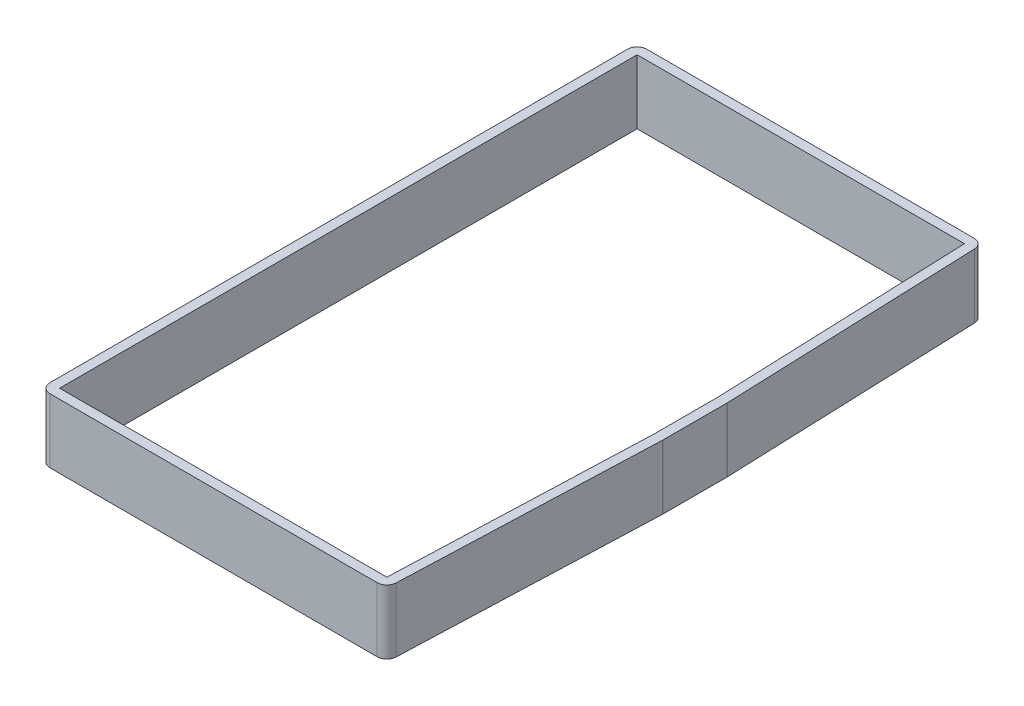
ISO-10303-21;
HEADER;
FILE_DESCRIPTION(('STEP AP214'),'2;1');
FILE_NAME('part.step','',(''),(''),'','','');
FILE_SCHEMA(('AUTOMOTIVE_DESIGN { 1 0 10303 214 1 1 1 1 }'));
ENDSEC;
DATA;
#1=APPLICATION_CONTEXT('core data for automotive mechanical design processes');
#2=APPLICATION_PROTOCOL_DEFINITION('international standard','automotive_design',2000,#1);
#3=PRODUCT_CONTEXT('',#1,'mechanical');
#4=PRODUCT('Part','Part','',(#3));
#5=PRODUCT_RELATED_PRODUCT_CATEGORY('part','',(#4));
#6=PRODUCT_DEFINITION_FORMATION('','',#4);
#7=PRODUCT_DEFINITION_CONTEXT('part definition',#1,'design');
#8=PRODUCT_DEFINITION('design','',#6,#7);
#9=PRODUCT_DEFINITION_SHAPE('','',#8);
#10=(LENGTH_UNIT() NAMED_UNIT(*) SI_UNIT(.MILLI.,.METRE.));
#11=(NAMED_UNIT(*) PLANE_ANGLE_UNIT() SI_UNIT($,.RADIAN.));
#12=(NAMED_UNIT(*) SI_UNIT($,.STERADIAN.) SOLID_ANGLE_UNIT());
#13=UNCERTAINTY_MEASURE_WITH_UNIT(LENGTH_MEASURE(1.E-05),#10,'distance_accuracy_value','');
#14=(GEOMETRIC_REPRESENTATION_CONTEXT(3) GLOBAL_UNCERTAINTY_ASSIGNED_CONTEXT((#13)) GLOBAL_UNIT_ASSIGNED_CONTEXT((#10,
#11,#12)) REPRESENTATION_CONTEXT('',''));
#15=CARTESIAN_POINT('',(0.,0.,0.));
#16=DIRECTION('',(0.,0.,1.));
#17=DIRECTION('',(1.,0.,0.));
#18=AXIS2_PLACEMENT_3D('',#15,#16,#17);
#19=CARTESIAN_POINT('',(0.,10.,0.));
#20=DIRECTION('',(0.,1.,0.));
#21=DIRECTION('',(0.,0.,1.));
#22=AXIS2_PLACEMENT_3D('',#19,#20,#21);
#23=PLANE('',#22);
#24=DIRECTION('',(-1.,0.,0.));
#25=VECTOR('',#24,1.);
#26=CARTESIAN_POINT('',(0.,10.,-92.9999999999999));
#27=LINE('',#26,#25);
#28=CARTESIAN_POINT('',(51.,10.,-92.9999999999999));
#29=VERTEX_POINT('',#28);
#30=CARTESIAN_POINT('',(-51.,10.,-92.9999999999999));
#31=VERTEX_POINT('',#30);
#32=EDGE_CURVE('E266',#29,#31,#27,.T.);
#33=ORIENTED_EDGE('',*,*,#32,.T.);
#34=CARTESIAN_POINT('',(-51.,10.,-89.9999999999999));
#35=DIRECTION('',(0.,1.,0.));
#36=DIRECTION('',(0.,0.,1.));
#37=AXIS2_PLACEMENT_3D('',#34,#35,#36);
#38=CIRCLE('',#37,3.);
#39=CARTESIAN_POINT('',(-54.,10.,-89.9999999999999));
#40=VERTEX_POINT('',#39);
#41=EDGE_CURVE('E323',#31,#40,#38,.T.);
#42=ORIENTED_EDGE('',*,*,#41,.T.);
#43=DIRECTION('',(0.,0.,1.));
#44=VECTOR('',#43,1.);
#45=CARTESIAN_POINT('',(-54.,10.,0.));
#46=LINE('',#45,#44);
#47=CARTESIAN_POINT('',(-54.,10.,90.0000000000001));
#48=VERTEX_POINT('',#47);
#49=EDGE_CURVE('E270',#40,#48,#46,.T.);
#50=ORIENTED_EDGE('',*,*,#49,.T.);
#51=CARTESIAN_POINT('',(-51.,10.,90.0000000000001));
#52=DIRECTION('',(0.,1.,0.));
#53=DIRECTION('',(0.,0.,1.));
#54=AXIS2_PLACEMENT_3D('',#51,#52,#53);
#55=CIRCLE('',#54,3.);
#56=CARTESIAN_POINT('',(-51.,10.,93.0000000000001));
#57=VERTEX_POINT('',#56);
#58=EDGE_CURVE('E314',#48,#57,#55,.T.);
#59=ORIENTED_EDGE('',*,*,#58,.T.);
#60=DIRECTION('',(1.,0.,0.));
#61=VECTOR('',#60,1.);
#62=CARTESIAN_POINT('',(0.,10.,93.0000000000001));
#63=LINE('',#62,#61);
#64=CARTESIAN_POINT('',(51.,10.,93.0000000000001));
#65=VERTEX_POINT('',#64);
#66=EDGE_CURVE('E273',#57,#65,#63,.T.);
#67=ORIENTED_EDGE('',*,*,#66,.T.);
#68=CARTESIAN_POINT('',(51.,10.,90.0000000000001));
#69=DIRECTION('',(0.,1.,0.));
#70=DIRECTION('',(0.,0.,1.));
#71=AXIS2_PLACEMENT_3D('',#68,#69,#70);
#72=CIRCLE('',#71,3.);
#73=CARTESIAN_POINT('',(53.9978928471276,10.,90.1124209817674));
#74=VERTEX_POINT('',#73);
#75=EDGE_CURVE('E97',#65,#74,#72,.T.);
#76=ORIENTED_EDGE('',*,*,#75,.T.);
#77=DIRECTION('',(0.0374736605890939,0.,-0.999297615709181));
#78=VECTOR('',#77,1.);
#79=CARTESIAN_POINT('',(57.2965353810642,10.,2.14862007678989));
#80=LINE('',#79,#78);
#81=CARTESIAN_POINT('',(56.9978928471275,10.,10.1124209817675));
#82=VERTEX_POINT('',#81);
#83=EDGE_CURVE('E275',#74,#82,#80,.T.);
#84=ORIENTED_EDGE('',*,*,#83,.T.);
#85=CARTESIAN_POINT('',(54.,10.,10.0000000000002));
#86=DIRECTION('',(0.,1.,0.));
#87=DIRECTION('',(0.,0.,1.));
#88=AXIS2_PLACEMENT_3D('',#85,#86,#87);
#89=CIRCLE('',#88,3.);
#90=CARTESIAN_POINT('',(57.,10.,10.0000000000002));
#91=VERTEX_POINT('',#90);
#92=EDGE_CURVE('E317',#82,#91,#89,.T.);
#93=ORIENTED_EDGE('',*,*,#92,.T.);
#94=DIRECTION('',(0.,0.,-1.));
#95=VECTOR('',#94,1.);
#96=CARTESIAN_POINT('',(57.,10.,0.));
#97=LINE('',#96,#95);
#98=CARTESIAN_POINT('',(57.,10.,-9.99999999999981));
#99=VERTEX_POINT('',#98);
#100=EDGE_CURVE('E259',#91,#99,#97,.T.);
#101=ORIENTED_EDGE('',*,*,#100,.T.);
#102=CARTESIAN_POINT('',(54.,10.,-9.99999999999981));
#103=DIRECTION('',(0.,1.,0.));
#104=DIRECTION('',(0.,0.,1.));
#105=AXIS2_PLACEMENT_3D('',#102,#103,#104);
#106=CIRCLE('',#105,3.);
#107=CARTESIAN_POINT('',(56.9978928471275,10.,-10.1124209817671));
#108=VERTEX_POINT('',#107);
#109=EDGE_CURVE('E319',#99,#108,#106,.T.);
#110=ORIENTED_EDGE('',*,*,#109,.T.);
#111=DIRECTION('',(-0.0374736605890941,0.,-0.999297615709181));
#112=VECTOR('',#111,1.);
#113=CARTESIAN_POINT('',(57.2965353810642,10.,-2.14862007678989));
#114=LINE('',#113,#112);
#115=CARTESIAN_POINT('',(53.9978928471275,10.,-90.1124209817672));
#116=VERTEX_POINT('',#115);
#117=EDGE_CURVE('E262',#108,#116,#114,.T.);
#118=ORIENTED_EDGE('',*,*,#117,.T.);
#119=CARTESIAN_POINT('',(51.,10.,-89.9999999999999));
#120=DIRECTION('',(0.,1.,0.));
#121=DIRECTION('',(0.,0.,1.));
#122=AXIS2_PLACEMENT_3D('',#119,#120,#121);
#123=CIRCLE('',#122,3.);
#124=EDGE_CURVE('E321',#116,#29,#123,.T.);
#125=ORIENTED_EDGE('',*,*,#124,.T.);
#126=EDGE_LOOP('',(#33,#42,#50,#59,#67,#76,#84,#93,#101,#110,#118,#125));
#127=FACE_BOUND('',#126,.T.);
#128=DIRECTION('',(-0.0374736605890941,0.,-0.999297615709181));
#129=VECTOR('',#128,1.);
#130=CARTESIAN_POINT('',(54.,10.,-10.));
#131=LINE('',#130,#129);
#132=CARTESIAN_POINT('',(54.,10.,-10.));
#133=VERTEX_POINT('',#132);
#134=CARTESIAN_POINT('',(51.,10.,-89.9999999999999));
#135=VERTEX_POINT('',#134);
#136=EDGE_CURVE('E212',#133,#135,#131,.T.);
#137=ORIENTED_EDGE('',*,*,#136,.F.);
#138=DIRECTION('',(0.,0.,-1.));
#139=VECTOR('',#138,1.);
#140=CARTESIAN_POINT('',(54.,10.,9.99999999999999));
#141=LINE('',#140,#139);
#142=CARTESIAN_POINT('',(54.,10.,9.99999999999999));
#143=VERTEX_POINT('',#142);
#144=EDGE_CURVE('E202',#143,#133,#141,.T.);
#145=ORIENTED_EDGE('',*,*,#144,.F.);
#146=DIRECTION('',(0.0374736605890939,0.,-0.999297615709181));
#147=VECTOR('',#146,1.);
#148=CARTESIAN_POINT('',(51.,10.,90.0000000000001));
#149=LINE('',#148,#147);
#150=CARTESIAN_POINT('',(51.,10.,90.));
#151=VERTEX_POINT('',#150);
#152=EDGE_CURVE('E235',#151,#143,#149,.T.);
#153=ORIENTED_EDGE('',*,*,#152,.F.);
#154=DIRECTION('',(1.,0.,0.));
#155=VECTOR('',#154,1.);
#156=CARTESIAN_POINT('',(-51.,10.,90.0000000000001));
#157=LINE('',#156,#155);
#158=CARTESIAN_POINT('',(-51.,10.,90.0000000000001));
#159=VERTEX_POINT('',#158);
#160=EDGE_CURVE('E232',#159,#151,#157,.T.);
#161=ORIENTED_EDGE('',*,*,#160,.F.);
#162=DIRECTION('',(0.,0.,1.));
#163=VECTOR('',#162,1.);
#164=CARTESIAN_POINT('',(-51.,10.,-89.9999999999999));
#165=LINE('',#164,#163);
#166=CARTESIAN_POINT('',(-51.,10.,-89.9999999999999));
#167=VERTEX_POINT('',#166);
#168=EDGE_CURVE('E228',#167,#159,#165,.T.);
#169=ORIENTED_EDGE('',*,*,#168,.F.);
#170=DIRECTION('',(-1.,0.,0.));
#171=VECTOR('',#170,1.);
#172=CARTESIAN_POINT('',(-51.,10.,-89.9999999999999));
#173=LINE('',#172,#171);
#174=EDGE_CURVE('E225',#135,#167,#173,.T.);
#175=ORIENTED_EDGE('',*,*,#174,.F.);
#176=EDGE_LOOP('',(#137,#145,#153,#161,#169,#175));
#177=FACE_BOUND('',#176,.T.);
#178=ADVANCED_FACE('F75',(#127,#177),#23,.T.);
#179=CARTESIAN_POINT('',(0.,-10.,0.));
#180=DIRECTION('',(0.,1.,0.));
#181=DIRECTION('',(0.,0.,1.));
#182=AXIS2_PLACEMENT_3D('',#179,#180,#181);
#183=PLANE('',#182);
#184=DIRECTION('',(0.,0.,1.));
#185=VECTOR('',#184,1.);
#186=CARTESIAN_POINT('',(-54.,-10.,0.));
#187=LINE('',#186,#185);
#188=CARTESIAN_POINT('',(-54.,-10.,-89.9999999999999));
#189=VERTEX_POINT('',#188);
#190=CARTESIAN_POINT('',(-54.,-10.,90.0000000000001));
#191=VERTEX_POINT('',#190);
#192=EDGE_CURVE('E286',#189,#191,#187,.T.);
#193=ORIENTED_EDGE('',*,*,#192,.F.);
#194=CARTESIAN_POINT('',(-51.,-10.,-89.9999999999999));
#195=DIRECTION('',(0.,1.,0.));
#196=DIRECTION('',(0.,0.,1.));
#197=AXIS2_PLACEMENT_3D('',#194,#195,#196);
#198=CIRCLE('',#197,3.);
#199=CARTESIAN_POINT('',(-51.,-10.,-92.9999999999999));
#200=VERTEX_POINT('',#199);
#201=EDGE_CURVE('E307',#189,#200,#198,.F.);
#202=ORIENTED_EDGE('',*,*,#201,.T.);
#203=DIRECTION('',(-1.,0.,0.));
#204=VECTOR('',#203,1.);
#205=CARTESIAN_POINT('',(0.,-10.,-92.9999999999999));
#206=LINE('',#205,#204);
#207=CARTESIAN_POINT('',(51.,-10.,-92.9999999999999));
#208=VERTEX_POINT('',#207);
#209=EDGE_CURVE('E283',#208,#200,#206,.T.);
#210=ORIENTED_EDGE('',*,*,#209,.F.);
#211=CARTESIAN_POINT('',(51.,-10.,-89.9999999999999));
#212=DIRECTION('',(0.,1.,0.));
#213=DIRECTION('',(0.,0.,1.));
#214=AXIS2_PLACEMENT_3D('',#211,#212,#213);
#215=CIRCLE('',#214,3.);
#216=CARTESIAN_POINT('',(53.9978928471275,-10.,-90.1124209817672));
#217=VERTEX_POINT('',#216);
#218=EDGE_CURVE('E305',#208,#217,#215,.F.);
#219=ORIENTED_EDGE('',*,*,#218,.T.);
#220=DIRECTION('',(-0.0374736605890941,0.,-0.999297615709181));
#221=VECTOR('',#220,1.);
#222=CARTESIAN_POINT('',(57.2965353810642,-10.,-2.14862007678989));
#223=LINE('',#222,#221);
#224=CARTESIAN_POINT('',(56.9978928471275,-10.,-10.1124209817671));
#225=VERTEX_POINT('',#224);
#226=EDGE_CURVE('E280',#225,#217,#223,.T.);
#227=ORIENTED_EDGE('',*,*,#226,.F.);
#228=CARTESIAN_POINT('',(54.,-10.,-9.99999999999981));
#229=DIRECTION('',(0.,1.,0.));
#230=DIRECTION('',(0.,0.,1.));
#231=AXIS2_PLACEMENT_3D('',#228,#229,#230);
#232=CIRCLE('',#231,3.);
#233=CARTESIAN_POINT('',(57.,-10.,-9.99999999999981));
#234=VERTEX_POINT('',#233);
#235=EDGE_CURVE('E303',#225,#234,#232,.F.);
#236=ORIENTED_EDGE('',*,*,#235,.T.);
#237=DIRECTION('',(0.,0.,-1.));
#238=VECTOR('',#237,1.);
#239=CARTESIAN_POINT('',(57.,-10.,0.));
#240=LINE('',#239,#238);
#241=CARTESIAN_POINT('',(57.,-10.,10.0000000000002));
#242=VERTEX_POINT('',#241);
#243=EDGE_CURVE('E220',#242,#234,#240,.T.);
#244=ORIENTED_EDGE('',*,*,#243,.F.);
#245=CARTESIAN_POINT('',(54.,-10.,10.0000000000002));
#246=DIRECTION('',(0.,1.,0.));
#247=DIRECTION('',(0.,0.,1.));
#248=AXIS2_PLACEMENT_3D('',#245,#246,#247);
#249=CIRCLE('',#248,3.);
#250=CARTESIAN_POINT('',(56.9978928471275,-10.,10.1124209817675));
#251=VERTEX_POINT('',#250);
#252=EDGE_CURVE('E301',#242,#251,#249,.F.);
#253=ORIENTED_EDGE('',*,*,#252,.T.);
#254=DIRECTION('',(0.0374736605890939,0.,-0.999297615709181));
#255=VECTOR('',#254,1.);
#256=CARTESIAN_POINT('',(57.2965353810642,-10.,2.14862007678989));
#257=LINE('',#256,#255);
#258=CARTESIAN_POINT('',(53.9978928471276,-10.,90.1124209817674));
#259=VERTEX_POINT('',#258);
#260=EDGE_CURVE('E263',#259,#251,#257,.T.);
#261=ORIENTED_EDGE('',*,*,#260,.F.);
#262=CARTESIAN_POINT('',(51.,-10.,90.0000000000001));
#263=DIRECTION('',(0.,1.,0.));
#264=DIRECTION('',(0.,0.,1.));
#265=AXIS2_PLACEMENT_3D('',#262,#263,#264);
#266=CIRCLE('',#265,3.);
#267=CARTESIAN_POINT('',(51.,-10.,93.0000000000001));
#268=VERTEX_POINT('',#267);
#269=EDGE_CURVE('E299',#259,#268,#266,.F.);
#270=ORIENTED_EDGE('',*,*,#269,.T.);
#271=DIRECTION('',(1.,0.,0.));
#272=VECTOR('',#271,1.);
#273=CARTESIAN_POINT('',(0.,-10.,93.0000000000001));
#274=LINE('',#273,#272);
#275=CARTESIAN_POINT('',(-51.,-10.,93.0000000000001));
#276=VERTEX_POINT('',#275);
#277=EDGE_CURVE('E289',#276,#268,#274,.T.);
#278=ORIENTED_EDGE('',*,*,#277,.F.);
#279=CARTESIAN_POINT('',(-51.,-10.,90.0000000000001));
#280=DIRECTION('',(0.,1.,0.));
#281=DIRECTION('',(0.,0.,1.));
#282=AXIS2_PLACEMENT_3D('',#279,#280,#281);
#283=CIRCLE('',#282,3.);
#284=EDGE_CURVE('E297',#276,#191,#283,.F.);
#285=ORIENTED_EDGE('',*,*,#284,.T.);
#286=EDGE_LOOP('',(#193,#202,#210,#219,#227,#236,#244,#253,#261,#270,#278,#285));
#287=FACE_BOUND('',#286,.T.);
#288=DIRECTION('',(0.,0.,-1.));
#289=VECTOR('',#288,1.);
#290=CARTESIAN_POINT('',(54.,-10.,9.99999999999999));
#291=LINE('',#290,#289);
#292=CARTESIAN_POINT('',(54.,-10.,10.));
#293=VERTEX_POINT('',#292);
#294=CARTESIAN_POINT('',(54.,-10.,-10.));
#295=VERTEX_POINT('',#294);
#296=EDGE_CURVE('E237',#293,#295,#291,.T.);
#297=ORIENTED_EDGE('',*,*,#296,.T.);
#298=DIRECTION('',(-0.0374736605890941,0.,-0.999297615709181));
#299=VECTOR('',#298,1.);
#300=CARTESIAN_POINT('',(54.,-10.,-10.));
#301=LINE('',#300,#299);
#302=CARTESIAN_POINT('',(51.,-10.,-89.9999999999999));
#303=VERTEX_POINT('',#302);
#304=EDGE_CURVE('E219',#295,#303,#301,.T.);
#305=ORIENTED_EDGE('',*,*,#304,.T.);
#306=DIRECTION('',(-1.,0.,0.));
#307=VECTOR('',#306,1.);
#308=CARTESIAN_POINT('',(-51.,-10.,-89.9999999999999));
#309=LINE('',#308,#307);
#310=CARTESIAN_POINT('',(-51.,-10.,-89.9999999999999));
#311=VERTEX_POINT('',#310);
#312=EDGE_CURVE('E240',#303,#311,#309,.T.);
#313=ORIENTED_EDGE('',*,*,#312,.T.);
#314=DIRECTION('',(0.,0.,1.));
#315=VECTOR('',#314,1.);
#316=CARTESIAN_POINT('',(-51.,-10.,-89.9999999999999));
#317=LINE('',#316,#315);
#318=CARTESIAN_POINT('',(-51.,-10.,90.0000000000001));
#319=VERTEX_POINT('',#318);
#320=EDGE_CURVE('E243',#311,#319,#317,.T.);
#321=ORIENTED_EDGE('',*,*,#320,.T.);
#322=DIRECTION('',(1.,0.,0.));
#323=VECTOR('',#322,1.);
#324=CARTESIAN_POINT('',(-51.,-10.,90.0000000000001));
#325=LINE('',#324,#323);
#326=CARTESIAN_POINT('',(51.,-10.,90.0000000000001));
#327=VERTEX_POINT('',#326);
#328=EDGE_CURVE('E246',#319,#327,#325,.T.);
#329=ORIENTED_EDGE('',*,*,#328,.T.);
#330=DIRECTION('',(0.0374736605890939,0.,-0.999297615709181));
#331=VECTOR('',#330,1.);
#332=CARTESIAN_POINT('',(51.,-10.,90.0000000000001));
#333=LINE('',#332,#331);
#334=EDGE_CURVE('E213',#327,#293,#333,.T.);
#335=ORIENTED_EDGE('',*,*,#334,.T.);
#336=EDGE_LOOP('',(#297,#305,#313,#321,#329,#335));
#337=FACE_BOUND('',#336,.T.);
#338=ADVANCED_FACE('F349',(#287,#337),#183,.F.);
#339=CARTESIAN_POINT('',(57.,10.,0.));
#340=DIRECTION('',(-1.,0.,0.));
#341=DIRECTION('',(0.,0.,1.));
#342=AXIS2_PLACEMENT_3D('',#339,#340,#341);
#343=PLANE('',#342);
#344=ORIENTED_EDGE('',*,*,#243,.T.);
#345=DIRECTION('',(0.,-1.,0.));
#346=VECTOR('',#345,1.);
#347=CARTESIAN_POINT('',(57.,10.,-9.99999999999981));
#348=LINE('',#347,#346);
#349=EDGE_CURVE('E333',#234,#99,#348,.F.);
#350=ORIENTED_EDGE('',*,*,#349,.T.);
#351=ORIENTED_EDGE('',*,*,#100,.F.);
#352=DIRECTION('',(0.,-1.,0.));
#353=VECTOR('',#352,1.);
#354=CARTESIAN_POINT('',(57.,10.,10.0000000000002));
#355=LINE('',#354,#353);
#356=EDGE_CURVE('E330',#91,#242,#355,.T.);
#357=ORIENTED_EDGE('',*,*,#356,.T.);
#358=EDGE_LOOP('',(#344,#350,#351,#357));
#359=FACE_BOUND('',#358,.T.);
#360=ADVANCED_FACE('F363',(#359),#343,.F.);
#361=CARTESIAN_POINT('',(57.2965353810642,10.,-2.14862007678989));
#362=DIRECTION('',(-0.999297615709181,0.,0.0374736605890941));
#363=DIRECTION('',(0.0374736605890941,0.,0.999297615709181));
#364=AXIS2_PLACEMENT_3D('',#361,#362,#363);
#365=PLANE('',#364);
#366=ORIENTED_EDGE('',*,*,#226,.T.);
#367=DIRECTION('',(0.,-1.,0.));
#368=VECTOR('',#367,1.);
#369=CARTESIAN_POINT('',(53.9978928471275,10.,-90.1124209817672));
#370=LINE('',#369,#368);
#371=EDGE_CURVE('E328',#217,#116,#370,.F.);
#372=ORIENTED_EDGE('',*,*,#371,.T.);
#373=ORIENTED_EDGE('',*,*,#117,.F.);
#374=DIRECTION('',(0.,-1.,0.));
#375=VECTOR('',#374,1.);
#376=CARTESIAN_POINT('',(56.9978928471275,10.,-10.1124209817671));
#377=LINE('',#376,#375);
#378=EDGE_CURVE('E325',#108,#225,#377,.T.);
#379=ORIENTED_EDGE('',*,*,#378,.T.);
#380=EDGE_LOOP('',(#366,#372,#373,#379));
#381=FACE_BOUND('',#380,.T.);
#382=ADVANCED_FACE('F372',(#381),#365,.F.);
#383=CARTESIAN_POINT('',(0.,10.,-92.9999999999999));
#384=DIRECTION('',(0.,0.,1.));
#385=DIRECTION('',(1.,0.,0.));
#386=AXIS2_PLACEMENT_3D('',#383,#384,#385);
#387=PLANE('',#386);
#388=ORIENTED_EDGE('',*,*,#209,.T.);
#389=DIRECTION('',(0.,-1.,0.));
#390=VECTOR('',#389,1.);
#391=CARTESIAN_POINT('',(-51.,10.,-92.9999999999999));
#392=LINE('',#391,#390);
#393=EDGE_CURVE('E312',#200,#31,#392,.F.);
#394=ORIENTED_EDGE('',*,*,#393,.T.);
#395=ORIENTED_EDGE('',*,*,#32,.F.);
#396=DIRECTION('',(0.,-1.,0.));
#397=VECTOR('',#396,1.);
#398=CARTESIAN_POINT('',(51.,10.,-92.9999999999999));
#399=LINE('',#398,#397);
#400=EDGE_CURVE('E309',#29,#208,#399,.T.);
#401=ORIENTED_EDGE('',*,*,#400,.T.);
#402=EDGE_LOOP('',(#388,#394,#395,#401));
#403=FACE_BOUND('',#402,.T.);
#404=ADVANCED_FACE('F381',(#403),#387,.F.);
#405=CARTESIAN_POINT('',(-54.,10.,0.));
#406=DIRECTION('',(1.,0.,0.));
#407=DIRECTION('',(0.,0.,-1.));
#408=AXIS2_PLACEMENT_3D('',#405,#406,#407);
#409=PLANE('',#408);
#410=ORIENTED_EDGE('',*,*,#49,.F.);
#411=DIRECTION('',(0.,-1.,0.));
#412=VECTOR('',#411,1.);
#413=CARTESIAN_POINT('',(-54.,10.,-89.9999999999999));
#414=LINE('',#413,#412);
#415=EDGE_CURVE('E294',#40,#189,#414,.T.);
#416=ORIENTED_EDGE('',*,*,#415,.T.);
#417=ORIENTED_EDGE('',*,*,#192,.T.);
#418=DIRECTION('',(0.,-1.,0.));
#419=VECTOR('',#418,1.);
#420=CARTESIAN_POINT('',(-54.,10.,90.0000000000001));
#421=LINE('',#420,#419);
#422=EDGE_CURVE('E277',#191,#48,#421,.F.);
#423=ORIENTED_EDGE('',*,*,#422,.T.);
#424=EDGE_LOOP('',(#410,#416,#417,#423));
#425=FACE_BOUND('',#424,.T.);
#426=ADVANCED_FACE('F389',(#425),#409,.F.);
#427=CARTESIAN_POINT('',(0.,10.,93.0000000000001));
#428=DIRECTION('',(0.,0.,-1.));
#429=DIRECTION('',(-1.,0.,0.));
#430=AXIS2_PLACEMENT_3D('',#427,#428,#429);
#431=PLANE('',#430);
#432=ORIENTED_EDGE('',*,*,#277,.T.);
#433=DIRECTION('',(0.,-1.,0.));
#434=VECTOR('',#433,1.);
#435=CARTESIAN_POINT('',(51.,10.,93.0000000000001));
#436=LINE('',#435,#434);
#437=EDGE_CURVE('E12',#268,#65,#436,.F.);
#438=ORIENTED_EDGE('',*,*,#437,.T.);
#439=ORIENTED_EDGE('',*,*,#66,.F.);
#440=DIRECTION('',(0.,-1.,0.));
#441=VECTOR('',#440,1.);
#442=CARTESIAN_POINT('',(-51.,10.,93.0000000000001));
#443=LINE('',#442,#441);
#444=EDGE_CURVE('E83',#57,#276,#443,.T.);
#445=ORIENTED_EDGE('',*,*,#444,.T.);
#446=EDGE_LOOP('',(#432,#438,#439,#445));
#447=FACE_BOUND('',#446,.T.);
#448=ADVANCED_FACE('F343',(#447),#431,.F.);
#449=CARTESIAN_POINT('',(57.2965353810642,10.,2.14862007678989));
#450=DIRECTION('',(-0.999297615709181,0.,-0.0374736605890939));
#451=DIRECTION('',(-0.0374736605890939,0.,0.999297615709181));
#452=AXIS2_PLACEMENT_3D('',#449,#450,#451);
#453=PLANE('',#452);
#454=ORIENTED_EDGE('',*,*,#260,.T.);
#455=DIRECTION('',(0.,-1.,0.));
#456=VECTOR('',#455,1.);
#457=CARTESIAN_POINT('',(56.9978928471275,10.,10.1124209817675));
#458=LINE('',#457,#456);
#459=EDGE_CURVE('E90',#251,#82,#458,.F.);
#460=ORIENTED_EDGE('',*,*,#459,.T.);
#461=ORIENTED_EDGE('',*,*,#83,.F.);
#462=DIRECTION('',(0.,-1.,0.));
#463=VECTOR('',#462,1.);
#464=CARTESIAN_POINT('',(53.9978928471276,10.,90.1124209817673));
#465=LINE('',#464,#463);
#466=EDGE_CURVE('E335',#74,#259,#465,.T.);
#467=ORIENTED_EDGE('',*,*,#466,.T.);
#468=EDGE_LOOP('',(#454,#460,#461,#467));
#469=FACE_BOUND('',#468,.T.);
#470=ADVANCED_FACE('F355',(#469),#453,.F.);
#471=CARTESIAN_POINT('',(54.,10.,9.99999999999999));
#472=DIRECTION('',(-1.,0.,0.));
#473=DIRECTION('',(0.,0.,1.));
#474=AXIS2_PLACEMENT_3D('',#471,#472,#473);
#475=PLANE('',#474);
#476=ORIENTED_EDGE('',*,*,#296,.F.);
#477=DIRECTION('',(0.,-1.,0.));
#478=VECTOR('',#477,1.);
#479=CARTESIAN_POINT('',(54.,10.,9.99999999999999));
#480=LINE('',#479,#478);
#481=EDGE_CURVE('E208',#143,#293,#480,.T.);
#482=ORIENTED_EDGE('',*,*,#481,.F.);
#483=ORIENTED_EDGE('',*,*,#144,.T.);
#484=DIRECTION('',(0.,-1.,0.));
#485=VECTOR('',#484,1.);
#486=CARTESIAN_POINT('',(54.,10.,-10.));
#487=LINE('',#486,#485);
#488=EDGE_CURVE('E205',#133,#295,#487,.T.);
#489=ORIENTED_EDGE('',*,*,#488,.T.);
#490=EDGE_LOOP('',(#476,#482,#483,#489));
#491=FACE_BOUND('',#490,.T.);
#492=ADVANCED_FACE('F204',(#491),#475,.T.);
#493=CARTESIAN_POINT('',(54.,10.,-10.));
#494=DIRECTION('',(-0.999297615709181,0.,0.0374736605890941));
#495=DIRECTION('',(0.0374736605890941,0.,0.999297615709181));
#496=AXIS2_PLACEMENT_3D('',#493,#494,#495);
#497=PLANE('',#496);
#498=ORIENTED_EDGE('',*,*,#304,.F.);
#499=ORIENTED_EDGE('',*,*,#488,.F.);
#500=ORIENTED_EDGE('',*,*,#136,.T.);
#501=DIRECTION('',(0.,-1.,0.));
#502=VECTOR('',#501,1.);
#503=CARTESIAN_POINT('',(51.,10.,-89.9999999999999));
#504=LINE('',#503,#502);
#505=EDGE_CURVE('E221',#135,#303,#504,.T.);
#506=ORIENTED_EDGE('',*,*,#505,.T.);
#507=EDGE_LOOP('',(#498,#499,#500,#506));
#508=FACE_BOUND('',#507,.T.);
#509=ADVANCED_FACE('F216',(#508),#497,.T.);
#510=CARTESIAN_POINT('',(-51.,10.,-89.9999999999999));
#511=DIRECTION('',(0.,0.,1.));
#512=DIRECTION('',(1.,0.,0.));
#513=AXIS2_PLACEMENT_3D('',#510,#511,#512);
#514=PLANE('',#513);
#515=ORIENTED_EDGE('',*,*,#312,.F.);
#516=ORIENTED_EDGE('',*,*,#505,.F.);
#517=ORIENTED_EDGE('',*,*,#174,.T.);
#518=DIRECTION('',(0.,-1.,0.));
#519=VECTOR('',#518,1.);
#520=CARTESIAN_POINT('',(-51.,10.,-89.9999999999999));
#521=LINE('',#520,#519);
#522=EDGE_CURVE('E256',#167,#311,#521,.T.);
#523=ORIENTED_EDGE('',*,*,#522,.T.);
#524=EDGE_LOOP('',(#515,#516,#517,#523));
#525=FACE_BOUND('',#524,.T.);
#526=ADVANCED_FACE('F481',(#525),#514,.T.);
#527=CARTESIAN_POINT('',(-51.,10.,-89.9999999999999));
#528=DIRECTION('',(1.,0.,0.));
#529=DIRECTION('',(0.,0.,-1.));
#530=AXIS2_PLACEMENT_3D('',#527,#528,#529);
#531=PLANE('',#530);
#532=ORIENTED_EDGE('',*,*,#320,.F.);
#533=ORIENTED_EDGE('',*,*,#522,.F.);
#534=ORIENTED_EDGE('',*,*,#168,.T.);
#535=DIRECTION('',(0.,-1.,0.));
#536=VECTOR('',#535,1.);
#537=CARTESIAN_POINT('',(-51.,10.,90.0000000000001));
#538=LINE('',#537,#536);
#539=EDGE_CURVE('E254',#159,#319,#538,.T.);
#540=ORIENTED_EDGE('',*,*,#539,.T.);
#541=EDGE_LOOP('',(#532,#533,#534,#540));
#542=FACE_BOUND('',#541,.T.);
#543=ADVANCED_FACE('F472',(#542),#531,.T.);
#544=CARTESIAN_POINT('',(-51.,10.,90.0000000000001));
#545=DIRECTION('',(0.,0.,-1.));
#546=DIRECTION('',(-1.,0.,0.));
#547=AXIS2_PLACEMENT_3D('',#544,#545,#546);
#548=PLANE('',#547);
#549=ORIENTED_EDGE('',*,*,#328,.F.);
#550=ORIENTED_EDGE('',*,*,#539,.F.);
#551=ORIENTED_EDGE('',*,*,#160,.T.);
#552=DIRECTION('',(0.,-1.,0.));
#553=VECTOR('',#552,1.);
#554=CARTESIAN_POINT('',(51.,10.,90.0000000000001));
#555=LINE('',#554,#553);
#556=EDGE_CURVE('E252',#151,#327,#555,.T.);
#557=ORIENTED_EDGE('',*,*,#556,.T.);
#558=EDGE_LOOP('',(#549,#550,#551,#557));
#559=FACE_BOUND('',#558,.T.);
#560=ADVANCED_FACE('F463',(#559),#548,.T.);
#561=CARTESIAN_POINT('',(51.,10.,90.0000000000001));
#562=DIRECTION('',(-0.999297615709181,0.,-0.0374736605890939));
#563=DIRECTION('',(-0.0374736605890939,0.,0.999297615709181));
#564=AXIS2_PLACEMENT_3D('',#561,#562,#563);
#565=PLANE('',#564);
#566=ORIENTED_EDGE('',*,*,#334,.F.);
#567=ORIENTED_EDGE('',*,*,#556,.F.);
#568=ORIENTED_EDGE('',*,*,#152,.T.);
#569=ORIENTED_EDGE('',*,*,#481,.T.);
#570=EDGE_LOOP('',(#566,#567,#568,#569));
#571=FACE_BOUND('',#570,.T.);
#572=ADVANCED_FACE('F418',(#571),#565,.T.);
#573=CARTESIAN_POINT('',(-51.,10.,-89.9999999999999));
#574=DIRECTION('',(0.,-1.,0.));
#575=DIRECTION('',(0.,0.,-1.));
#576=AXIS2_PLACEMENT_3D('',#573,#574,#575);
#577=CYLINDRICAL_SURFACE('',#576,3.);
#578=ORIENTED_EDGE('',*,*,#41,.F.);
#579=ORIENTED_EDGE('',*,*,#393,.F.);
#580=ORIENTED_EDGE('',*,*,#201,.F.);
#581=ORIENTED_EDGE('',*,*,#415,.F.);
#582=EDGE_LOOP('',(#578,#579,#580,#581));
#583=FACE_BOUND('',#582,.T.);
#584=ADVANCED_FACE('F386',(#583),#577,.T.);
#585=CARTESIAN_POINT('',(51.,10.,-89.9999999999999));
#586=DIRECTION('',(0.,-1.,0.));
#587=DIRECTION('',(0.,0.,-1.));
#588=AXIS2_PLACEMENT_3D('',#585,#586,#587);
#589=CYLINDRICAL_SURFACE('',#588,3.);
#590=ORIENTED_EDGE('',*,*,#124,.F.);
#591=ORIENTED_EDGE('',*,*,#371,.F.);
#592=ORIENTED_EDGE('',*,*,#218,.F.);
#593=ORIENTED_EDGE('',*,*,#400,.F.);
#594=EDGE_LOOP('',(#590,#591,#592,#593));
#595=FACE_BOUND('',#594,.T.);
#596=ADVANCED_FACE('F378',(#595),#589,.T.);
#597=CARTESIAN_POINT('',(54.,10.,-9.99999999999981));
#598=DIRECTION('',(0.,-1.,0.));
#599=DIRECTION('',(0.,0.,-1.));
#600=AXIS2_PLACEMENT_3D('',#597,#598,#599);
#601=CYLINDRICAL_SURFACE('',#600,3.);
#602=ORIENTED_EDGE('',*,*,#109,.F.);
#603=ORIENTED_EDGE('',*,*,#349,.F.);
#604=ORIENTED_EDGE('',*,*,#235,.F.);
#605=ORIENTED_EDGE('',*,*,#378,.F.);
#606=EDGE_LOOP('',(#602,#603,#604,#605));
#607=FACE_BOUND('',#606,.T.);
#608=ADVANCED_FACE('F369',(#607),#601,.T.);
#609=CARTESIAN_POINT('',(54.,10.,10.0000000000002));
#610=DIRECTION('',(0.,-1.,0.));
#611=DIRECTION('',(0.,0.,-1.));
#612=AXIS2_PLACEMENT_3D('',#609,#610,#611);
#613=CYLINDRICAL_SURFACE('',#612,3.);
#614=ORIENTED_EDGE('',*,*,#92,.F.);
#615=ORIENTED_EDGE('',*,*,#459,.F.);
#616=ORIENTED_EDGE('',*,*,#252,.F.);
#617=ORIENTED_EDGE('',*,*,#356,.F.);
#618=EDGE_LOOP('',(#614,#615,#616,#617));
#619=FACE_BOUND('',#618,.T.);
#620=ADVANCED_FACE('F360',(#619),#613,.T.);
#621=CARTESIAN_POINT('',(51.,10.,90.0000000000001));
#622=DIRECTION('',(0.,-1.,0.));
#623=DIRECTION('',(0.,0.,-1.));
#624=AXIS2_PLACEMENT_3D('',#621,#622,#623);
#625=CYLINDRICAL_SURFACE('',#624,3.);
#626=ORIENTED_EDGE('',*,*,#75,.F.);
#627=ORIENTED_EDGE('',*,*,#437,.F.);
#628=ORIENTED_EDGE('',*,*,#269,.F.);
#629=ORIENTED_EDGE('',*,*,#466,.F.);
#630=EDGE_LOOP('',(#626,#627,#628,#629));
#631=FACE_BOUND('',#630,.T.);
#632=ADVANCED_FACE('F354',(#631),#625,.T.);
#633=CARTESIAN_POINT('',(-51.,10.,90.0000000000001));
#634=DIRECTION('',(0.,-1.,0.));
#635=DIRECTION('',(0.,0.,-1.));
#636=AXIS2_PLACEMENT_3D('',#633,#634,#635);
#637=CYLINDRICAL_SURFACE('',#636,3.);
#638=ORIENTED_EDGE('',*,*,#58,.F.);
#639=ORIENTED_EDGE('',*,*,#422,.F.);
#640=ORIENTED_EDGE('',*,*,#284,.F.);
#641=ORIENTED_EDGE('',*,*,#444,.F.);
#642=EDGE_LOOP('',(#638,#639,#640,#641));
#643=FACE_BOUND('',#642,.T.);
#644=ADVANCED_FACE('F77',(#643),#637,.T.);
#645=CLOSED_SHELL('',(#178,#338,#360,#382,#404,#426,#448,#470,#492,#509,#526,#543,#560,#572,
#584,#596,#608,#620,#632,#644));
#646=MANIFOLD_SOLID_BREP('B2',#645);
#647=ADVANCED_BREP_SHAPE_REPRESENTATION('',(#18,#646),#14);
#648=SHAPE_DEFINITION_REPRESENTATION(#9,#647);
ENDSEC;
END-ISO-10303-21;
